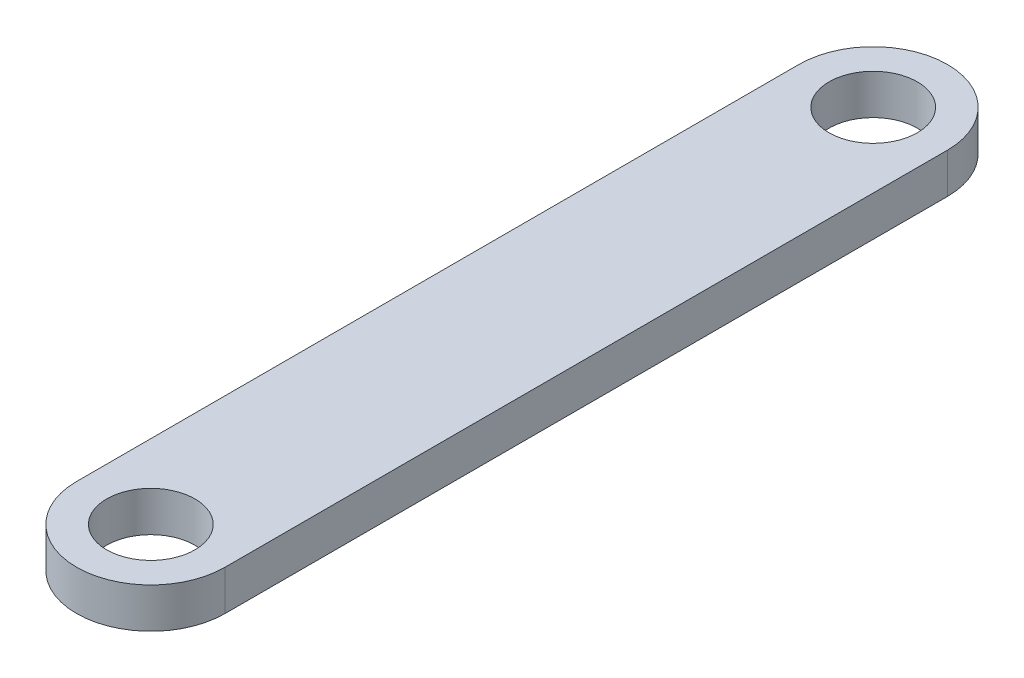
ISO-10303-21;
HEADER;
FILE_DESCRIPTION(('STEP AP214'),'2;1');
FILE_NAME('part.step','',(''),(''),'','','');
FILE_SCHEMA(('AUTOMOTIVE_DESIGN { 1 0 10303 214 1 1 1 1 }'));
ENDSEC;
DATA;
#1=APPLICATION_CONTEXT('core data for automotive mechanical design processes');
#2=APPLICATION_PROTOCOL_DEFINITION('international standard','automotive_design',2000,#1);
#3=PRODUCT_CONTEXT('',#1,'mechanical');
#4=PRODUCT('Part','Part','',(#3));
#5=PRODUCT_RELATED_PRODUCT_CATEGORY('part','',(#4));
#6=PRODUCT_DEFINITION_FORMATION('','',#4);
#7=PRODUCT_DEFINITION_CONTEXT('part definition',#1,'design');
#8=PRODUCT_DEFINITION('design','',#6,#7);
#9=PRODUCT_DEFINITION_SHAPE('','',#8);
#10=(LENGTH_UNIT() NAMED_UNIT(*) SI_UNIT(.MILLI.,.METRE.));
#11=(NAMED_UNIT(*) PLANE_ANGLE_UNIT() SI_UNIT($,.RADIAN.));
#12=(NAMED_UNIT(*) SI_UNIT($,.STERADIAN.) SOLID_ANGLE_UNIT());
#13=UNCERTAINTY_MEASURE_WITH_UNIT(LENGTH_MEASURE(1.E-05),#10,'distance_accuracy_value','');
#14=(GEOMETRIC_REPRESENTATION_CONTEXT(3) GLOBAL_UNCERTAINTY_ASSIGNED_CONTEXT((#13)) GLOBAL_UNIT_ASSIGNED_CONTEXT((#10,
#11,#12)) REPRESENTATION_CONTEXT('',''));
#15=CARTESIAN_POINT('',(0.,0.,0.));
#16=DIRECTION('',(0.,0.,1.));
#17=DIRECTION('',(1.,0.,0.));
#18=AXIS2_PLACEMENT_3D('',#15,#16,#17);
#19=CARTESIAN_POINT('',(18.5,10.,0.));
#20=DIRECTION('',(-1.,0.,0.));
#21=DIRECTION('',(0.,0.,1.));
#22=AXIS2_PLACEMENT_3D('',#19,#20,#21);
#23=PLANE('',#22);
#24=DIRECTION('',(0.,0.,-1.));
#25=VECTOR('',#24,1.);
#26=CARTESIAN_POINT('',(18.5,0.,0.));
#27=LINE('',#26,#25);
#28=CARTESIAN_POINT('',(18.5,0.,90.));
#29=VERTEX_POINT('',#28);
#30=CARTESIAN_POINT('',(18.5,0.,-90.));
#31=VERTEX_POINT('',#30);
#32=EDGE_CURVE('E106',#29,#31,#27,.T.);
#33=ORIENTED_EDGE('',*,*,#32,.T.);
#34=DIRECTION('',(0.,-1.,0.));
#35=VECTOR('',#34,1.);
#36=CARTESIAN_POINT('',(18.5,10.,-90.));
#37=LINE('',#36,#35);
#38=CARTESIAN_POINT('',(18.5,10.,-90.));
#39=VERTEX_POINT('',#38);
#40=EDGE_CURVE('E11',#39,#31,#37,.T.);
#41=ORIENTED_EDGE('',*,*,#40,.F.);
#42=DIRECTION('',(0.,0.,-1.));
#43=VECTOR('',#42,1.);
#44=CARTESIAN_POINT('',(18.5,10.,0.));
#45=LINE('',#44,#43);
#46=CARTESIAN_POINT('',(18.5,10.,90.));
#47=VERTEX_POINT('',#46);
#48=EDGE_CURVE('E86',#47,#39,#45,.T.);
#49=ORIENTED_EDGE('',*,*,#48,.F.);
#50=DIRECTION('',(0.,-1.,0.));
#51=VECTOR('',#50,1.);
#52=CARTESIAN_POINT('',(18.5,10.,90.));
#53=LINE('',#52,#51);
#54=EDGE_CURVE('E52',#47,#29,#53,.T.);
#55=ORIENTED_EDGE('',*,*,#54,.T.);
#56=EDGE_LOOP('',(#33,#41,#49,#55));
#57=FACE_BOUND('',#56,.T.);
#58=ADVANCED_FACE('F35',(#57),#23,.F.);
#59=CARTESIAN_POINT('',(0.,10.,-90.));
#60=DIRECTION('',(0.,-1.,0.));
#61=DIRECTION('',(0.,0.,-1.));
#62=AXIS2_PLACEMENT_3D('',#59,#60,#61);
#63=CYLINDRICAL_SURFACE('',#62,18.5);
#64=CARTESIAN_POINT('',(0.,0.,-90.));
#65=DIRECTION('',(0.,1.,0.));
#66=DIRECTION('',(0.,0.,1.));
#67=AXIS2_PLACEMENT_3D('',#64,#65,#66);
#68=CIRCLE('',#67,18.5);
#69=CARTESIAN_POINT('',(-18.5,0.,-90.));
#70=VERTEX_POINT('',#69);
#71=EDGE_CURVE('E91',#31,#70,#68,.T.);
#72=ORIENTED_EDGE('',*,*,#71,.T.);
#73=DIRECTION('',(0.,-1.,0.));
#74=VECTOR('',#73,1.);
#75=CARTESIAN_POINT('',(-18.5,10.,-90.));
#76=LINE('',#75,#74);
#77=CARTESIAN_POINT('',(-18.5,10.,-90.));
#78=VERTEX_POINT('',#77);
#79=EDGE_CURVE('E44',#78,#70,#76,.T.);
#80=ORIENTED_EDGE('',*,*,#79,.F.);
#81=CARTESIAN_POINT('',(0.,10.,-90.));
#82=DIRECTION('',(0.,1.,0.));
#83=DIRECTION('',(0.,0.,1.));
#84=AXIS2_PLACEMENT_3D('',#81,#82,#83);
#85=CIRCLE('',#84,18.5);
#86=EDGE_CURVE('E77',#39,#78,#85,.T.);
#87=ORIENTED_EDGE('',*,*,#86,.F.);
#88=ORIENTED_EDGE('',*,*,#40,.T.);
#89=EDGE_LOOP('',(#72,#80,#87,#88));
#90=FACE_BOUND('',#89,.T.);
#91=ADVANCED_FACE('F90',(#90),#63,.T.);
#92=CARTESIAN_POINT('',(-18.5,10.,0.));
#93=DIRECTION('',(-1.,0.,0.));
#94=DIRECTION('',(0.,0.,1.));
#95=AXIS2_PLACEMENT_3D('',#92,#93,#94);
#96=PLANE('',#95);
#97=DIRECTION('',(0.,0.,-1.));
#98=VECTOR('',#97,1.);
#99=CARTESIAN_POINT('',(-18.5,0.,0.));
#100=LINE('',#99,#98);
#101=CARTESIAN_POINT('',(-18.5,0.,90.));
#102=VERTEX_POINT('',#101);
#103=EDGE_CURVE('E109',#102,#70,#100,.T.);
#104=ORIENTED_EDGE('',*,*,#103,.F.);
#105=DIRECTION('',(0.,-1.,0.));
#106=VECTOR('',#105,1.);
#107=CARTESIAN_POINT('',(-18.5,10.,90.));
#108=LINE('',#107,#106);
#109=CARTESIAN_POINT('',(-18.5,10.,90.));
#110=VERTEX_POINT('',#109);
#111=EDGE_CURVE('E66',#110,#102,#108,.T.);
#112=ORIENTED_EDGE('',*,*,#111,.F.);
#113=DIRECTION('',(0.,0.,-1.));
#114=VECTOR('',#113,1.);
#115=CARTESIAN_POINT('',(-18.5,10.,0.));
#116=LINE('',#115,#114);
#117=EDGE_CURVE('E85',#110,#78,#116,.T.);
#118=ORIENTED_EDGE('',*,*,#117,.T.);
#119=ORIENTED_EDGE('',*,*,#79,.T.);
#120=EDGE_LOOP('',(#104,#112,#118,#119));
#121=FACE_BOUND('',#120,.T.);
#122=ADVANCED_FACE('F94',(#121),#96,.T.);
#123=CARTESIAN_POINT('',(0.,10.,90.));
#124=DIRECTION('',(0.,-1.,0.));
#125=DIRECTION('',(0.,0.,-1.));
#126=AXIS2_PLACEMENT_3D('',#123,#124,#125);
#127=CYLINDRICAL_SURFACE('',#126,18.5);
#128=CARTESIAN_POINT('',(0.,0.,90.));
#129=DIRECTION('',(0.,1.,0.));
#130=DIRECTION('',(0.,0.,1.));
#131=AXIS2_PLACEMENT_3D('',#128,#129,#130);
#132=CIRCLE('',#131,18.5);
#133=EDGE_CURVE('E111',#29,#102,#132,.F.);
#134=ORIENTED_EDGE('',*,*,#133,.F.);
#135=ORIENTED_EDGE('',*,*,#54,.F.);
#136=CARTESIAN_POINT('',(0.,10.,90.));
#137=DIRECTION('',(0.,1.,0.));
#138=DIRECTION('',(0.,0.,1.));
#139=AXIS2_PLACEMENT_3D('',#136,#137,#138);
#140=CIRCLE('',#139,18.5);
#141=EDGE_CURVE('E95',#47,#110,#140,.F.);
#142=ORIENTED_EDGE('',*,*,#141,.T.);
#143=ORIENTED_EDGE('',*,*,#111,.T.);
#144=EDGE_LOOP('',(#134,#135,#142,#143));
#145=FACE_BOUND('',#144,.T.);
#146=ADVANCED_FACE('F129',(#145),#127,.T.);
#147=CARTESIAN_POINT('',(0.,10.,90.));
#148=DIRECTION('',(0.,-1.,0.));
#149=DIRECTION('',(0.,0.,-1.));
#150=AXIS2_PLACEMENT_3D('',#147,#148,#149);
#151=CYLINDRICAL_SURFACE('',#150,11.);
#152=CARTESIAN_POINT('',(0.,10.,90.));
#153=DIRECTION('',(0.,1.,0.));
#154=DIRECTION('',(0.,0.,1.));
#155=AXIS2_PLACEMENT_3D('',#152,#153,#154);
#156=CIRCLE('',#155,11.);
#157=CARTESIAN_POINT('',(0.,10.,101.));
#158=VERTEX_POINT('',#157);
#159=EDGE_CURVE('E117',#158,#158,#156,.F.);
#160=ORIENTED_EDGE('',*,*,#159,.F.);
#161=EDGE_LOOP('',(#160));
#162=FACE_BOUND('',#161,.T.);
#163=CARTESIAN_POINT('',(0.,0.,90.));
#164=DIRECTION('',(0.,1.,0.));
#165=DIRECTION('',(0.,0.,1.));
#166=AXIS2_PLACEMENT_3D('',#163,#164,#165);
#167=CIRCLE('',#166,11.);
#168=CARTESIAN_POINT('',(0.,0.,101.));
#169=VERTEX_POINT('',#168);
#170=EDGE_CURVE('E103',#169,#169,#167,.F.);
#171=ORIENTED_EDGE('',*,*,#170,.T.);
#172=EDGE_LOOP('',(#171));
#173=FACE_BOUND('',#172,.T.);
#174=ADVANCED_FACE('F37',(#162,#173),#151,.F.);
#175=CARTESIAN_POINT('',(0.,10.,-90.));
#176=DIRECTION('',(0.,-1.,0.));
#177=DIRECTION('',(0.,0.,-1.));
#178=AXIS2_PLACEMENT_3D('',#175,#176,#177);
#179=CYLINDRICAL_SURFACE('',#178,11.);
#180=CARTESIAN_POINT('',(0.,10.,-90.));
#181=DIRECTION('',(0.,1.,0.));
#182=DIRECTION('',(0.,0.,1.));
#183=AXIS2_PLACEMENT_3D('',#180,#181,#182);
#184=CIRCLE('',#183,11.);
#185=CARTESIAN_POINT('',(0.,10.,-79.));
#186=VERTEX_POINT('',#185);
#187=EDGE_CURVE('E97',#186,#186,#184,.T.);
#188=ORIENTED_EDGE('',*,*,#187,.T.);
#189=EDGE_LOOP('',(#188));
#190=FACE_BOUND('',#189,.T.);
#191=CARTESIAN_POINT('',(0.,0.,-90.));
#192=DIRECTION('',(0.,1.,0.));
#193=DIRECTION('',(0.,0.,1.));
#194=AXIS2_PLACEMENT_3D('',#191,#192,#193);
#195=CIRCLE('',#194,11.);
#196=CARTESIAN_POINT('',(0.,0.,-79.));
#197=VERTEX_POINT('',#196);
#198=EDGE_CURVE('E114',#197,#197,#195,.T.);
#199=ORIENTED_EDGE('',*,*,#198,.F.);
#200=EDGE_LOOP('',(#199));
#201=FACE_BOUND('',#200,.T.);
#202=ADVANCED_FACE('F128',(#190,#201),#179,.F.);
#203=CARTESIAN_POINT('',(0.,10.,0.));
#204=DIRECTION('',(0.,1.,0.));
#205=DIRECTION('',(0.,0.,1.));
#206=AXIS2_PLACEMENT_3D('',#203,#204,#205);
#207=PLANE('',#206);
#208=ORIENTED_EDGE('',*,*,#159,.T.);
#209=EDGE_LOOP('',(#208));
#210=FACE_BOUND('',#209,.T.);
#211=ORIENTED_EDGE('',*,*,#48,.T.);
#212=ORIENTED_EDGE('',*,*,#86,.T.);
#213=ORIENTED_EDGE('',*,*,#117,.F.);
#214=ORIENTED_EDGE('',*,*,#141,.F.);
#215=EDGE_LOOP('',(#211,#212,#213,#214));
#216=FACE_BOUND('',#215,.T.);
#217=ORIENTED_EDGE('',*,*,#187,.F.);
#218=EDGE_LOOP('',(#217));
#219=FACE_BOUND('',#218,.T.);
#220=ADVANCED_FACE('F81',(#210,#216,#219),#207,.T.);
#221=CARTESIAN_POINT('',(0.,0.,0.));
#222=DIRECTION('',(0.,1.,0.));
#223=DIRECTION('',(0.,0.,1.));
#224=AXIS2_PLACEMENT_3D('',#221,#222,#223);
#225=PLANE('',#224);
#226=ORIENTED_EDGE('',*,*,#170,.F.);
#227=EDGE_LOOP('',(#226));
#228=FACE_BOUND('',#227,.T.);
#229=ORIENTED_EDGE('',*,*,#32,.F.);
#230=ORIENTED_EDGE('',*,*,#133,.T.);
#231=ORIENTED_EDGE('',*,*,#103,.T.);
#232=ORIENTED_EDGE('',*,*,#71,.F.);
#233=EDGE_LOOP('',(#229,#230,#231,#232));
#234=FACE_BOUND('',#233,.T.);
#235=ORIENTED_EDGE('',*,*,#198,.T.);
#236=EDGE_LOOP('',(#235));
#237=FACE_BOUND('',#236,.T.);
#238=ADVANCED_FACE('F132',(#228,#234,#237),#225,.F.);
#239=CLOSED_SHELL('',(#58,#91,#122,#146,#174,#202,#220,#238));
#240=MANIFOLD_SOLID_BREP('B2',#239);
#241=ADVANCED_BREP_SHAPE_REPRESENTATION('',(#18,#240),#14);
#242=SHAPE_DEFINITION_REPRESENTATION(#9,#241);
ENDSEC;
END-ISO-10303-21;
